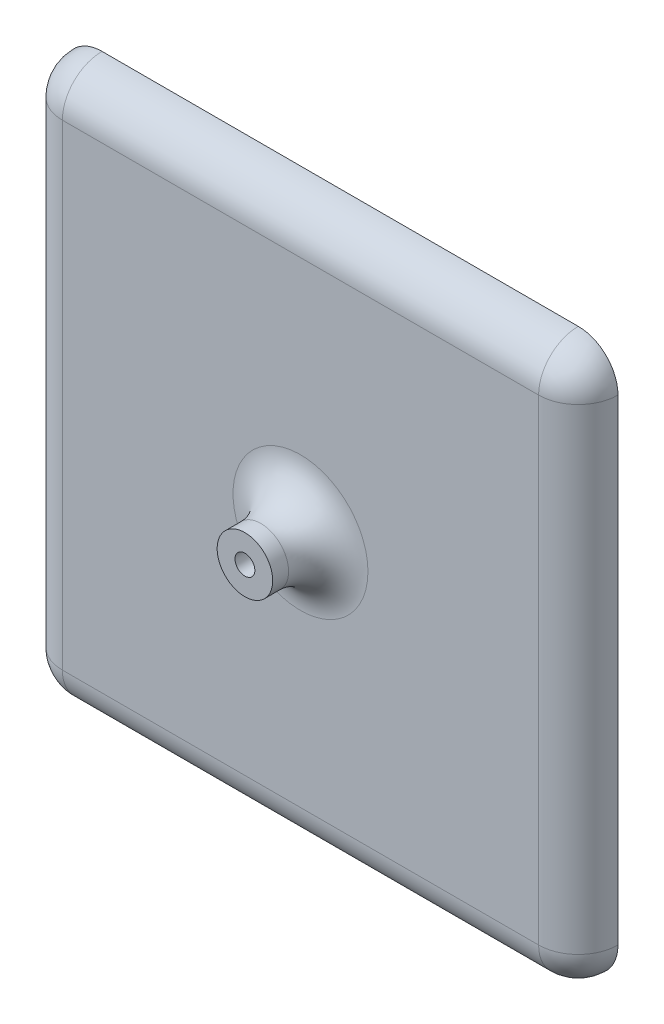
ISO-10303-21;
HEADER;
FILE_DESCRIPTION(('STEP AP214'),'2;1');
FILE_NAME('part.step','',(''),(''),'','','');
FILE_SCHEMA(('AUTOMOTIVE_DESIGN { 1 0 10303 214 1 1 1 1 }'));
ENDSEC;
DATA;
#1=APPLICATION_CONTEXT('core data for automotive mechanical design processes');
#2=APPLICATION_PROTOCOL_DEFINITION('international standard','automotive_design',2000,#1);
#3=PRODUCT_CONTEXT('',#1,'mechanical');
#4=PRODUCT('Part','Part','',(#3));
#5=PRODUCT_RELATED_PRODUCT_CATEGORY('part','',(#4));
#6=PRODUCT_DEFINITION_FORMATION('','',#4);
#7=PRODUCT_DEFINITION_CONTEXT('part definition',#1,'design');
#8=PRODUCT_DEFINITION('design','',#6,#7);
#9=PRODUCT_DEFINITION_SHAPE('','',#8);
#10=(LENGTH_UNIT() NAMED_UNIT(*) SI_UNIT(.MILLI.,.METRE.));
#11=(NAMED_UNIT(*) PLANE_ANGLE_UNIT() SI_UNIT($,.RADIAN.));
#12=(NAMED_UNIT(*) SI_UNIT($,.STERADIAN.) SOLID_ANGLE_UNIT());
#13=UNCERTAINTY_MEASURE_WITH_UNIT(LENGTH_MEASURE(1.E-05),#10,'distance_accuracy_value','');
#14=(GEOMETRIC_REPRESENTATION_CONTEXT(3) GLOBAL_UNCERTAINTY_ASSIGNED_CONTEXT((#13)) GLOBAL_UNIT_ASSIGNED_CONTEXT((#10,
#11,#12)) REPRESENTATION_CONTEXT('',''));
#15=CARTESIAN_POINT('',(0.,0.,0.));
#16=DIRECTION('',(0.,0.,1.));
#17=DIRECTION('',(1.,0.,0.));
#18=AXIS2_PLACEMENT_3D('',#15,#16,#17);
#19=CARTESIAN_POINT('',(0.,0.,10.));
#20=DIRECTION('',(0.,0.,1.));
#21=DIRECTION('',(1.,0.,0.));
#22=AXIS2_PLACEMENT_3D('',#19,#20,#21);
#23=PLANE('',#22);
#24=CARTESIAN_POINT('',(34.1306184521798,70.,10.));
#25=DIRECTION('',(0.,0.,1.));
#26=DIRECTION('',(1.,0.,0.));
#27=AXIS2_PLACEMENT_3D('',#24,#25,#26);
#28=CIRCLE('',#27,17.);
#29=CARTESIAN_POINT('',(51.1306184521798,70.,10.));
#30=VERTEX_POINT('',#29);
#31=EDGE_CURVE('E43',#30,#30,#28,.F.);
#32=ORIENTED_EDGE('',*,*,#31,.T.);
#33=EDGE_LOOP('',(#32));
#34=FACE_BOUND('',#33,.T.);
#35=DIRECTION('',(1.,0.,0.));
#36=VECTOR('',#35,1.);
#37=CARTESIAN_POINT('',(104.13061845218,10.,10.));
#38=LINE('',#37,#36);
#39=CARTESIAN_POINT('',(-25.8693815478202,10.,10.));
#40=VERTEX_POINT('',#39);
#41=CARTESIAN_POINT('',(94.1306184521798,10.,10.));
#42=VERTEX_POINT('',#41);
#43=EDGE_CURVE('E96',#40,#42,#38,.T.);
#44=ORIENTED_EDGE('',*,*,#43,.T.);
#45=DIRECTION('',(0.,1.,0.));
#46=VECTOR('',#45,1.);
#47=CARTESIAN_POINT('',(94.1306184521798,130.,10.));
#48=LINE('',#47,#46);
#49=CARTESIAN_POINT('',(94.1306184521798,130.,10.));
#50=VERTEX_POINT('',#49);
#51=EDGE_CURVE('E50',#42,#50,#48,.T.);
#52=ORIENTED_EDGE('',*,*,#51,.T.);
#53=DIRECTION('',(-1.,0.,0.));
#54=VECTOR('',#53,1.);
#55=CARTESIAN_POINT('',(-35.8693815478202,130.,10.));
#56=LINE('',#55,#54);
#57=CARTESIAN_POINT('',(-25.8693815478202,130.,10.));
#58=VERTEX_POINT('',#57);
#59=EDGE_CURVE('E114',#50,#58,#56,.T.);
#60=ORIENTED_EDGE('',*,*,#59,.T.);
#61=DIRECTION('',(0.,-1.,0.));
#62=VECTOR('',#61,1.);
#63=CARTESIAN_POINT('',(-25.8693815478202,10.,10.));
#64=LINE('',#63,#62);
#65=EDGE_CURVE('E101',#58,#40,#64,.T.);
#66=ORIENTED_EDGE('',*,*,#65,.T.);
#67=EDGE_LOOP('',(#44,#52,#60,#66));
#68=FACE_BOUND('',#67,.T.);
#69=ADVANCED_FACE('F35',(#34,#68),#23,.T.);
#70=CARTESIAN_POINT('',(0.,0.,0.));
#71=DIRECTION('',(0.,0.,1.));
#72=DIRECTION('',(1.,0.,0.));
#73=AXIS2_PLACEMENT_3D('',#70,#71,#72);
#74=PLANE('',#73);
#75=CARTESIAN_POINT('',(34.1306184521798,70.,0.));
#76=DIRECTION('',(0.,0.,1.));
#77=DIRECTION('',(1.,0.,0.));
#78=AXIS2_PLACEMENT_3D('',#75,#76,#77);
#79=CIRCLE('',#78,2.5);
#80=CARTESIAN_POINT('',(36.6306184521798,70.,0.));
#81=VERTEX_POINT('',#80);
#82=EDGE_CURVE('E199',#81,#81,#79,.T.);
#83=ORIENTED_EDGE('',*,*,#82,.T.);
#84=EDGE_LOOP('',(#83));
#85=FACE_BOUND('',#84,.T.);
#86=DIRECTION('',(0.,1.,0.));
#87=VECTOR('',#86,1.);
#88=CARTESIAN_POINT('',(104.13061845218,140.,0.));
#89=LINE('',#88,#87);
#90=CARTESIAN_POINT('',(104.13061845218,10.,0.));
#91=VERTEX_POINT('',#90);
#92=CARTESIAN_POINT('',(104.13061845218,130.,0.));
#93=VERTEX_POINT('',#92);
#94=EDGE_CURVE('E193',#91,#93,#89,.T.);
#95=ORIENTED_EDGE('',*,*,#94,.F.);
#96=CARTESIAN_POINT('',(94.1306184521798,10.,0.));
#97=DIRECTION('',(0.,0.,1.));
#98=DIRECTION('',(1.,0.,0.));
#99=AXIS2_PLACEMENT_3D('',#96,#97,#98);
#100=CIRCLE('',#99,10.);
#101=CARTESIAN_POINT('',(94.1306184521798,0.,0.));
#102=VERTEX_POINT('',#101);
#103=EDGE_CURVE('E107',#91,#102,#100,.F.);
#104=ORIENTED_EDGE('',*,*,#103,.T.);
#105=DIRECTION('',(1.,0.,0.));
#106=VECTOR('',#105,1.);
#107=CARTESIAN_POINT('',(-35.8693815478202,0.,0.));
#108=LINE('',#107,#106);
#109=CARTESIAN_POINT('',(-25.8693815478202,0.,0.));
#110=VERTEX_POINT('',#109);
#111=EDGE_CURVE('E95',#110,#102,#108,.T.);
#112=ORIENTED_EDGE('',*,*,#111,.F.);
#113=CARTESIAN_POINT('',(-25.8693815478202,10.,0.));
#114=DIRECTION('',(0.,0.,1.));
#115=DIRECTION('',(1.,0.,0.));
#116=AXIS2_PLACEMENT_3D('',#113,#114,#115);
#117=CIRCLE('',#116,10.);
#118=CARTESIAN_POINT('',(-35.8693815478202,10.,0.));
#119=VERTEX_POINT('',#118);
#120=EDGE_CURVE('E106',#110,#119,#117,.F.);
#121=ORIENTED_EDGE('',*,*,#120,.T.);
#122=DIRECTION('',(0.,-1.,0.));
#123=VECTOR('',#122,1.);
#124=CARTESIAN_POINT('',(-35.8693815478202,140.,0.));
#125=LINE('',#124,#123);
#126=CARTESIAN_POINT('',(-35.8693815478202,130.,0.));
#127=VERTEX_POINT('',#126);
#128=EDGE_CURVE('E108',#127,#119,#125,.T.);
#129=ORIENTED_EDGE('',*,*,#128,.F.);
#130=CARTESIAN_POINT('',(-25.8693815478202,130.,0.));
#131=DIRECTION('',(0.,0.,1.));
#132=DIRECTION('',(1.,0.,0.));
#133=AXIS2_PLACEMENT_3D('',#130,#131,#132);
#134=CIRCLE('',#133,10.);
#135=CARTESIAN_POINT('',(-25.8693815478202,140.,0.));
#136=VERTEX_POINT('',#135);
#137=EDGE_CURVE('E113',#127,#136,#134,.F.);
#138=ORIENTED_EDGE('',*,*,#137,.T.);
#139=DIRECTION('',(-1.,0.,0.));
#140=VECTOR('',#139,1.);
#141=CARTESIAN_POINT('',(-35.8693815478202,140.,0.));
#142=LINE('',#141,#140);
#143=CARTESIAN_POINT('',(94.1306184521798,140.,0.));
#144=VERTEX_POINT('',#143);
#145=EDGE_CURVE('E194',#144,#136,#142,.T.);
#146=ORIENTED_EDGE('',*,*,#145,.F.);
#147=CARTESIAN_POINT('',(94.1306184521798,130.,0.));
#148=DIRECTION('',(0.,0.,1.));
#149=DIRECTION('',(1.,0.,0.));
#150=AXIS2_PLACEMENT_3D('',#147,#148,#149);
#151=CIRCLE('',#150,10.);
#152=EDGE_CURVE('E124',#144,#93,#151,.F.);
#153=ORIENTED_EDGE('',*,*,#152,.T.);
#154=EDGE_LOOP('',(#95,#104,#112,#121,#129,#138,#146,#153));
#155=FACE_BOUND('',#154,.T.);
#156=ADVANCED_FACE('F105',(#85,#155),#74,.F.);
#157=CARTESIAN_POINT('',(34.1306184521798,70.,10.));
#158=DIRECTION('',(0.,0.,-1.));
#159=DIRECTION('',(-1.,0.,0.));
#160=AXIS2_PLACEMENT_3D('',#157,#158,#159);
#161=CYLINDRICAL_SURFACE('',#160,2.5);
#162=ORIENTED_EDGE('',*,*,#82,.F.);
#163=EDGE_LOOP('',(#162));
#164=FACE_BOUND('',#163,.T.);
#165=CARTESIAN_POINT('',(34.1306184521798,70.,24.));
#166=DIRECTION('',(0.,0.,1.));
#167=DIRECTION('',(1.,0.,0.));
#168=AXIS2_PLACEMENT_3D('',#165,#166,#167);
#169=CIRCLE('',#168,2.5);
#170=CARTESIAN_POINT('',(36.6306184521798,70.,24.));
#171=VERTEX_POINT('',#170);
#172=EDGE_CURVE('E130',#171,#171,#169,.T.);
#173=ORIENTED_EDGE('',*,*,#172,.T.);
#174=EDGE_LOOP('',(#173));
#175=FACE_BOUND('',#174,.T.);
#176=ADVANCED_FACE('F158',(#164,#175),#161,.F.);
#177=CARTESIAN_POINT('',(34.1306184521798,70.,24.));
#178=DIRECTION('',(0.,0.,1.));
#179=DIRECTION('',(1.,0.,0.));
#180=AXIS2_PLACEMENT_3D('',#177,#178,#179);
#181=PLANE('',#180);
#182=CARTESIAN_POINT('',(34.1306184521798,70.,24.));
#183=DIRECTION('',(0.,0.,1.));
#184=DIRECTION('',(1.,0.,0.));
#185=AXIS2_PLACEMENT_3D('',#182,#183,#184);
#186=CIRCLE('',#185,7.);
#187=CARTESIAN_POINT('',(27.1306184521798,70.,24.));
#188=VERTEX_POINT('',#187);
#189=EDGE_CURVE('E206',#188,#188,#186,.T.);
#190=ORIENTED_EDGE('',*,*,#189,.T.);
#191=EDGE_LOOP('',(#190));
#192=FACE_BOUND('',#191,.T.);
#193=ORIENTED_EDGE('',*,*,#172,.F.);
#194=EDGE_LOOP('',(#193));
#195=FACE_BOUND('',#194,.T.);
#196=ADVANCED_FACE('F213',(#192,#195),#181,.T.);
#197=CARTESIAN_POINT('',(34.1306184521798,70.,24.));
#198=DIRECTION('',(0.,0.,-1.));
#199=DIRECTION('',(-1.,0.,0.));
#200=AXIS2_PLACEMENT_3D('',#197,#198,#199);
#201=CYLINDRICAL_SURFACE('',#200,7.);
#202=CARTESIAN_POINT('',(34.1306184521798,70.,20.));
#203=DIRECTION('',(0.,0.,1.));
#204=DIRECTION('',(1.,0.,0.));
#205=AXIS2_PLACEMENT_3D('',#202,#203,#204);
#206=CIRCLE('',#205,7.);
#207=CARTESIAN_POINT('',(27.1306184521798,70.,20.));
#208=VERTEX_POINT('',#207);
#209=EDGE_CURVE('E11',#208,#208,#206,.T.);
#210=CARTESIAN_POINT('',(27.1306184521798,70.,20.));
#211=CARTESIAN_POINT('',(27.1306184521798,70.,20.0416666666667));
#212=CARTESIAN_POINT('',(27.1306184521798,70.,20.0833333333333));
#213=CARTESIAN_POINT('',(27.1306184521798,70.,20.1666666666667));
#214=CARTESIAN_POINT('',(27.1306184521798,70.,20.2083333333333));
#215=CARTESIAN_POINT('',(27.1306184521798,70.,20.2916666666667));
#216=CARTESIAN_POINT('',(27.1306184521798,70.,20.3333333333333));
#217=CARTESIAN_POINT('',(27.1306184521798,70.,20.4166666666667));
#218=CARTESIAN_POINT('',(27.1306184521798,70.,20.4583333333333));
#219=CARTESIAN_POINT('',(27.1306184521798,70.,20.5416666666667));
#220=CARTESIAN_POINT('',(27.1306184521798,70.,20.5833333333333));
#221=CARTESIAN_POINT('',(27.1306184521798,70.,20.6666666666667));
#222=CARTESIAN_POINT('',(27.1306184521798,70.,20.7083333333333));
#223=CARTESIAN_POINT('',(27.1306184521798,70.,20.7916666666667));
#224=CARTESIAN_POINT('',(27.1306184521798,70.,20.8333333333333));
#225=CARTESIAN_POINT('',(27.1306184521798,70.,20.9166666666667));
#226=CARTESIAN_POINT('',(27.1306184521798,70.,20.9583333333333));
#227=CARTESIAN_POINT('',(27.1306184521798,70.,21.0416666666667));
#228=CARTESIAN_POINT('',(27.1306184521798,70.,21.0833333333333));
#229=CARTESIAN_POINT('',(27.1306184521798,70.,21.1666666666667));
#230=CARTESIAN_POINT('',(27.1306184521798,70.,21.2083333333333));
#231=CARTESIAN_POINT('',(27.1306184521798,70.,21.2916666666667));
#232=CARTESIAN_POINT('',(27.1306184521798,70.,21.3333333333333));
#233=CARTESIAN_POINT('',(27.1306184521798,70.,21.4166666666667));
#234=CARTESIAN_POINT('',(27.1306184521798,70.,21.4583333333333));
#235=CARTESIAN_POINT('',(27.1306184521798,70.,21.5416666666667));
#236=CARTESIAN_POINT('',(27.1306184521798,70.,21.5833333333333));
#237=CARTESIAN_POINT('',(27.1306184521798,70.,21.6666666666667));
#238=CARTESIAN_POINT('',(27.1306184521798,70.,21.7083333333333));
#239=CARTESIAN_POINT('',(27.1306184521798,70.,21.7916666666667));
#240=CARTESIAN_POINT('',(27.1306184521798,70.,21.8333333333333));
#241=CARTESIAN_POINT('',(27.1306184521798,70.,21.9166666666667));
#242=CARTESIAN_POINT('',(27.1306184521798,70.,21.9583333333333));
#243=CARTESIAN_POINT('',(27.1306184521798,70.,22.0416666666667));
#244=CARTESIAN_POINT('',(27.1306184521798,70.,22.0833333333333));
#245=CARTESIAN_POINT('',(27.1306184521798,70.,22.1666666666667));
#246=CARTESIAN_POINT('',(27.1306184521798,70.,22.2083333333333));
#247=CARTESIAN_POINT('',(27.1306184521798,70.,22.2916666666667));
#248=CARTESIAN_POINT('',(27.1306184521798,70.,22.3333333333333));
#249=CARTESIAN_POINT('',(27.1306184521798,70.,22.4166666666667));
#250=CARTESIAN_POINT('',(27.1306184521798,70.,22.4583333333333));
#251=CARTESIAN_POINT('',(27.1306184521798,70.,22.5416666666667));
#252=CARTESIAN_POINT('',(27.1306184521798,70.,22.5833333333333));
#253=CARTESIAN_POINT('',(27.1306184521798,70.,22.6666666666667));
#254=CARTESIAN_POINT('',(27.1306184521798,70.,22.7083333333333));
#255=CARTESIAN_POINT('',(27.1306184521798,70.,22.7916666666667));
#256=CARTESIAN_POINT('',(27.1306184521798,70.,22.8333333333333));
#257=CARTESIAN_POINT('',(27.1306184521798,70.,22.9166666666667));
#258=CARTESIAN_POINT('',(27.1306184521798,70.,22.9583333333333));
#259=CARTESIAN_POINT('',(27.1306184521798,70.,23.0416666666667));
#260=CARTESIAN_POINT('',(27.1306184521798,70.,23.0833333333333));
#261=CARTESIAN_POINT('',(27.1306184521798,70.,23.1666666666667));
#262=CARTESIAN_POINT('',(27.1306184521798,70.,23.2083333333333));
#263=CARTESIAN_POINT('',(27.1306184521798,70.,23.2916666666667));
#264=CARTESIAN_POINT('',(27.1306184521798,70.,23.3333333333333));
#265=CARTESIAN_POINT('',(27.1306184521798,70.,23.4166666666667));
#266=CARTESIAN_POINT('',(27.1306184521798,70.,23.4583333333333));
#267=CARTESIAN_POINT('',(27.1306184521798,70.,23.5416666666667));
#268=CARTESIAN_POINT('',(27.1306184521798,70.,23.5833333333333));
#269=CARTESIAN_POINT('',(27.1306184521798,70.,23.6666666666667));
#270=CARTESIAN_POINT('',(27.1306184521798,70.,23.7083333333333));
#271=CARTESIAN_POINT('',(27.1306184521798,70.,23.7916666666667));
#272=CARTESIAN_POINT('',(27.1306184521798,70.,23.8333333333333));
#273=CARTESIAN_POINT('',(27.1306184521798,70.,23.9166666666667));
#274=CARTESIAN_POINT('',(27.1306184521798,70.,23.9583333333333));
#275=CARTESIAN_POINT('',(27.1306184521798,70.,24.));
#276=B_SPLINE_CURVE_WITH_KNOTS('',3,(#210,#211,#212,#213,#214,#215,#216,#217,#218,#219,#220,
#221,#222,#223,#224,#225,#226,#227,#228,#229,#230,#231,#232,#233,#234,#235,#236,#237,#238,#239,
#240,#241,#242,#243,#244,#245,#246,#247,#248,#249,#250,#251,#252,#253,#254,#255,#256,#257,#258,
#259,#260,#261,#262,#263,#264,#265,#266,#267,#268,#269,#270,#271,#272,#273,#274,#275),
.UNSPECIFIED.,.F.,.F.,(4,2,2,2,2,2,2,2,2,2,2,2,2,2,2,2,2,2,2,2,2,2,2,2,2,2,2,2,2,2,2,2,4),(0.,
0.125,0.25,0.375,0.5,0.625000000000001,0.750000000000001,0.875000000000001,1.,1.125,1.25,1.375,
1.5,1.625,1.75,1.875,2.,2.125,2.25,2.375,2.5,2.625,2.75,2.875,3.,3.125,3.25,3.375,3.5,3.625,
3.75,3.875,4.),.UNSPECIFIED.);
#277=EDGE_CURVE('BSEAM167',#208,#188,#276,.T.);
#278=ORIENTED_EDGE('',*,*,#209,.T.);
#279=ORIENTED_EDGE('',*,*,#189,.F.);
#280=ORIENTED_EDGE('',*,*,#277,.T.);
#281=ORIENTED_EDGE('',*,*,#277,.F.);
#282=EDGE_LOOP('',(#278,#280,#279,#281));
#283=FACE_BOUND('',#282,.T.);
#284=ADVANCED_FACE('F167',(#283),#201,.T.);
#285=CARTESIAN_POINT('',(0.,10.,0.));
#286=DIRECTION('',(-1.,0.,0.));
#287=DIRECTION('',(0.,0.,1.));
#288=AXIS2_PLACEMENT_3D('',#285,#286,#287);
#289=CYLINDRICAL_SURFACE('',#288,10.);
#290=ORIENTED_EDGE('',*,*,#111,.T.);
#291=CARTESIAN_POINT('',(94.1306184521798,10.,0.));
#292=DIRECTION('',(-1.,0.,0.));
#293=DIRECTION('',(0.,0.,1.));
#294=AXIS2_PLACEMENT_3D('',#291,#292,#293);
#295=CIRCLE('',#294,10.);
#296=EDGE_CURVE('E133',#102,#42,#295,.T.);
#297=ORIENTED_EDGE('',*,*,#296,.T.);
#298=ORIENTED_EDGE('',*,*,#43,.F.);
#299=CARTESIAN_POINT('',(-25.8693815478202,10.,0.));
#300=DIRECTION('',(-1.,0.,0.));
#301=DIRECTION('',(0.,0.,1.));
#302=AXIS2_PLACEMENT_3D('',#299,#300,#301);
#303=CIRCLE('',#302,10.);
#304=EDGE_CURVE('E91',#40,#110,#303,.F.);
#305=ORIENTED_EDGE('',*,*,#304,.T.);
#306=EDGE_LOOP('',(#290,#297,#298,#305));
#307=FACE_BOUND('',#306,.T.);
#308=ADVANCED_FACE('F93',(#307),#289,.T.);
#309=CARTESIAN_POINT('',(0.,130.,0.));
#310=DIRECTION('',(1.,0.,0.));
#311=DIRECTION('',(0.,1.,0.));
#312=AXIS2_PLACEMENT_3D('',#309,#310,#311);
#313=CYLINDRICAL_SURFACE('',#312,10.);
#314=ORIENTED_EDGE('',*,*,#59,.F.);
#315=CARTESIAN_POINT('',(94.1306184521798,130.,0.));
#316=DIRECTION('',(1.,0.,0.));
#317=DIRECTION('',(0.,1.,0.));
#318=AXIS2_PLACEMENT_3D('',#315,#316,#317);
#319=CIRCLE('',#318,10.);
#320=EDGE_CURVE('E135',#50,#144,#319,.F.);
#321=ORIENTED_EDGE('',*,*,#320,.T.);
#322=ORIENTED_EDGE('',*,*,#145,.T.);
#323=CARTESIAN_POINT('',(-25.8693815478202,130.,0.));
#324=DIRECTION('',(1.,0.,0.));
#325=DIRECTION('',(0.,1.,0.));
#326=AXIS2_PLACEMENT_3D('',#323,#324,#325);
#327=CIRCLE('',#326,10.);
#328=EDGE_CURVE('E102',#136,#58,#327,.T.);
#329=ORIENTED_EDGE('',*,*,#328,.T.);
#330=EDGE_LOOP('',(#314,#321,#322,#329));
#331=FACE_BOUND('',#330,.T.);
#332=ADVANCED_FACE('F166',(#331),#313,.T.);
#333=CARTESIAN_POINT('',(-25.8693815478202,10.,0.));
#334=DIRECTION('',(0.,0.,1.));
#335=DIRECTION('',(1.,0.,0.));
#336=AXIS2_PLACEMENT_3D('',#333,#334,#335);
#337=SPHERICAL_SURFACE('',#336,10.);
#338=ORIENTED_EDGE('',*,*,#120,.F.);
#339=ORIENTED_EDGE('',*,*,#304,.F.);
#340=CARTESIAN_POINT('',(-25.8693815478202,10.,0.));
#341=DIRECTION('',(0.,1.,0.));
#342=DIRECTION('',(-1.,0.,0.));
#343=AXIS2_PLACEMENT_3D('',#340,#341,#342);
#344=CIRCLE('',#343,10.);
#345=EDGE_CURVE('E111',#119,#40,#344,.T.);
#346=ORIENTED_EDGE('',*,*,#345,.F.);
#347=EDGE_LOOP('',(#338,#339,#346));
#348=FACE_BOUND('',#347,.T.);
#349=ADVANCED_FACE('F110',(#348),#337,.T.);
#350=CARTESIAN_POINT('',(-25.8693815478202,0.,0.));
#351=DIRECTION('',(0.,1.,0.));
#352=DIRECTION('',(-1.,0.,0.));
#353=AXIS2_PLACEMENT_3D('',#350,#351,#352);
#354=CYLINDRICAL_SURFACE('',#353,10.);
#355=ORIENTED_EDGE('',*,*,#345,.T.);
#356=ORIENTED_EDGE('',*,*,#65,.F.);
#357=CARTESIAN_POINT('',(-25.8693815478202,130.,0.));
#358=DIRECTION('',(0.,1.,0.));
#359=DIRECTION('',(0.,0.,1.));
#360=AXIS2_PLACEMENT_3D('',#357,#358,#359);
#361=CIRCLE('',#360,10.);
#362=EDGE_CURVE('E125',#127,#58,#361,.T.);
#363=ORIENTED_EDGE('',*,*,#362,.F.);
#364=ORIENTED_EDGE('',*,*,#128,.T.);
#365=EDGE_LOOP('',(#355,#356,#363,#364));
#366=FACE_BOUND('',#365,.T.);
#367=ADVANCED_FACE('F175',(#366),#354,.T.);
#368=CARTESIAN_POINT('',(-25.8693815478202,130.,0.));
#369=DIRECTION('',(0.,0.,1.));
#370=DIRECTION('',(1.,0.,0.));
#371=AXIS2_PLACEMENT_3D('',#368,#369,#370);
#372=SPHERICAL_SURFACE('',#371,10.);
#373=ORIENTED_EDGE('',*,*,#362,.T.);
#374=ORIENTED_EDGE('',*,*,#328,.F.);
#375=ORIENTED_EDGE('',*,*,#137,.F.);
#376=EDGE_LOOP('',(#373,#374,#375));
#377=FACE_BOUND('',#376,.T.);
#378=ADVANCED_FACE('F171',(#377),#372,.T.);
#379=CARTESIAN_POINT('',(94.1306184521798,130.,0.));
#380=DIRECTION('',(0.,0.,1.));
#381=DIRECTION('',(1.,0.,0.));
#382=AXIS2_PLACEMENT_3D('',#379,#380,#381);
#383=SPHERICAL_SURFACE('',#382,10.);
#384=ORIENTED_EDGE('',*,*,#152,.F.);
#385=ORIENTED_EDGE('',*,*,#320,.F.);
#386=CARTESIAN_POINT('',(94.1306184521798,130.,0.));
#387=DIRECTION('',(0.,-1.,0.));
#388=DIRECTION('',(0.,0.,-1.));
#389=AXIS2_PLACEMENT_3D('',#386,#387,#388);
#390=CIRCLE('',#389,10.);
#391=EDGE_CURVE('E128',#93,#50,#390,.T.);
#392=ORIENTED_EDGE('',*,*,#391,.F.);
#393=EDGE_LOOP('',(#384,#385,#392));
#394=FACE_BOUND('',#393,.T.);
#395=ADVANCED_FACE('F174',(#394),#383,.T.);
#396=CARTESIAN_POINT('',(94.1306184521798,0.,0.));
#397=DIRECTION('',(0.,-1.,0.));
#398=DIRECTION('',(0.,0.,-1.));
#399=AXIS2_PLACEMENT_3D('',#396,#397,#398);
#400=CYLINDRICAL_SURFACE('',#399,10.);
#401=ORIENTED_EDGE('',*,*,#391,.T.);
#402=ORIENTED_EDGE('',*,*,#51,.F.);
#403=CARTESIAN_POINT('',(94.1306184521798,10.,0.));
#404=DIRECTION('',(0.,-1.,0.));
#405=DIRECTION('',(0.,0.,-1.));
#406=AXIS2_PLACEMENT_3D('',#403,#404,#405);
#407=CIRCLE('',#406,10.);
#408=EDGE_CURVE('E58',#91,#42,#407,.T.);
#409=ORIENTED_EDGE('',*,*,#408,.F.);
#410=ORIENTED_EDGE('',*,*,#94,.T.);
#411=EDGE_LOOP('',(#401,#402,#409,#410));
#412=FACE_BOUND('',#411,.T.);
#413=ADVANCED_FACE('F150',(#412),#400,.T.);
#414=CARTESIAN_POINT('',(94.1306184521798,10.,0.));
#415=DIRECTION('',(0.,0.,1.));
#416=DIRECTION('',(1.,0.,0.));
#417=AXIS2_PLACEMENT_3D('',#414,#415,#416);
#418=SPHERICAL_SURFACE('',#417,10.);
#419=ORIENTED_EDGE('',*,*,#408,.T.);
#420=ORIENTED_EDGE('',*,*,#296,.F.);
#421=ORIENTED_EDGE('',*,*,#103,.F.);
#422=EDGE_LOOP('',(#419,#420,#421));
#423=FACE_BOUND('',#422,.T.);
#424=ADVANCED_FACE('F145',(#423),#418,.T.);
#425=CARTESIAN_POINT('',(34.1306184521798,70.,20.));
#426=DIRECTION('',(0.,0.,1.));
#427=DIRECTION('',(1.,0.,0.));
#428=AXIS2_PLACEMENT_3D('',#425,#426,#427);
#429=TOROIDAL_SURFACE('',#428,17.,10.);
#430=ORIENTED_EDGE('',*,*,#209,.F.);
#431=EDGE_LOOP('',(#430));
#432=FACE_BOUND('',#431,.T.);
#433=ORIENTED_EDGE('',*,*,#31,.F.);
#434=EDGE_LOOP('',(#433));
#435=FACE_BOUND('',#434,.T.);
#436=ADVANCED_FACE('F37',(#432,#435),#429,.F.);
#437=CLOSED_SHELL('',(#69,#156,#176,#196,#284,#308,#332,#349,#367,#378,#395,#413,#424,#436));
#438=MANIFOLD_SOLID_BREP('B2',#437);
#439=ADVANCED_BREP_SHAPE_REPRESENTATION('',(#18,#438),#14);
#440=SHAPE_DEFINITION_REPRESENTATION(#9,#439);
ENDSEC;
END-ISO-10303-21;
